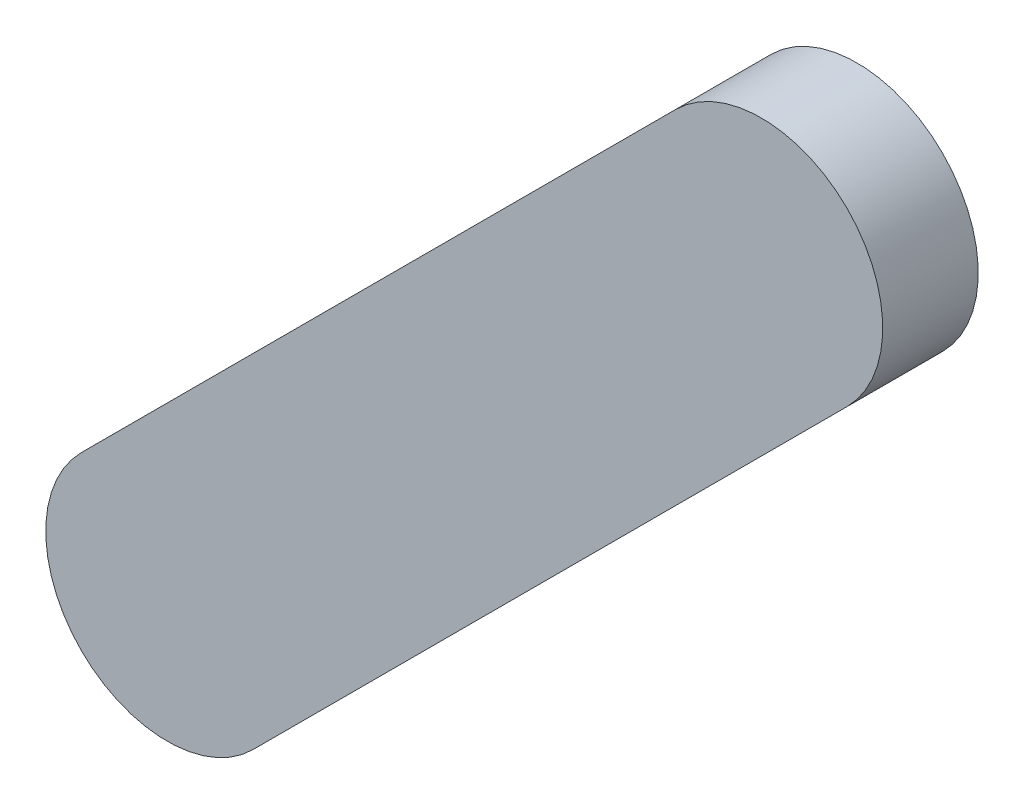
ISO-10303-21;
HEADER;
FILE_DESCRIPTION(('STEP AP214'),'2;1');
FILE_NAME('part.step','',(''),(''),'','','');
FILE_SCHEMA(('AUTOMOTIVE_DESIGN { 1 0 10303 214 1 1 1 1 }'));
ENDSEC;
DATA;
#1=APPLICATION_CONTEXT('core data for automotive mechanical design processes');
#2=APPLICATION_PROTOCOL_DEFINITION('international standard','automotive_design',2000,#1);
#3=PRODUCT_CONTEXT('',#1,'mechanical');
#4=PRODUCT('Part','Part','',(#3));
#5=PRODUCT_RELATED_PRODUCT_CATEGORY('part','',(#4));
#6=PRODUCT_DEFINITION_FORMATION('','',#4);
#7=PRODUCT_DEFINITION_CONTEXT('part definition',#1,'design');
#8=PRODUCT_DEFINITION('design','',#6,#7);
#9=PRODUCT_DEFINITION_SHAPE('','',#8);
#10=(LENGTH_UNIT() NAMED_UNIT(*) SI_UNIT(.MILLI.,.METRE.));
#11=(NAMED_UNIT(*) PLANE_ANGLE_UNIT() SI_UNIT($,.RADIAN.));
#12=(NAMED_UNIT(*) SI_UNIT($,.STERADIAN.) SOLID_ANGLE_UNIT());
#13=UNCERTAINTY_MEASURE_WITH_UNIT(LENGTH_MEASURE(1.E-05),#10,'distance_accuracy_value','');
#14=(GEOMETRIC_REPRESENTATION_CONTEXT(3) GLOBAL_UNCERTAINTY_ASSIGNED_CONTEXT((#13)) GLOBAL_UNIT_ASSIGNED_CONTEXT((#10,
#11,#12)) REPRESENTATION_CONTEXT('',''));
#15=CARTESIAN_POINT('',(0.,0.,0.));
#16=DIRECTION('',(0.,0.,1.));
#17=DIRECTION('',(1.,0.,0.));
#18=AXIS2_PLACEMENT_3D('',#15,#16,#17);
#19=CARTESIAN_POINT('',(113.66680594,53.5667966,0.));
#20=DIRECTION('',(-0.707106781186543,0.707106781186552,0.));
#21=DIRECTION('',(0.707106781186552,0.707106781186543,0.));
#22=AXIS2_PLACEMENT_3D('',#19,#20,#21);
#23=PLANE('',#22);
#24=DIRECTION('',(0.707106781186552,0.707106781186543,0.));
#25=VECTOR('',#24,1.);
#26=CARTESIAN_POINT('',(113.66680594,53.5667966,0.1999996));
#27=LINE('',#26,#25);
#28=CARTESIAN_POINT('',(113.66680594,53.5667966,0.1999996));
#29=VERTEX_POINT('',#28);
#30=CARTESIAN_POINT('',(114.9114034,54.81139406,0.1999996));
#31=VERTEX_POINT('',#30);
#32=EDGE_CURVE('E11',#29,#31,#27,.T.);
#33=ORIENTED_EDGE('',*,*,#32,.F.);
#34=DIRECTION('',(0.,0.,1.));
#35=VECTOR('',#34,1.);
#36=CARTESIAN_POINT('',(113.66680594,53.5667966,0.));
#37=LINE('',#36,#35);
#38=CARTESIAN_POINT('',(113.66680594,53.5667966,0.));
#39=VERTEX_POINT('',#38);
#40=EDGE_CURVE('E24',#39,#29,#37,.T.);
#41=ORIENTED_EDGE('',*,*,#40,.F.);
#42=DIRECTION('',(0.707106781186552,0.707106781186543,0.));
#43=VECTOR('',#42,1.);
#44=CARTESIAN_POINT('',(113.66680594,53.5667966,0.));
#45=LINE('',#44,#43);
#46=CARTESIAN_POINT('',(114.9114034,54.81139406,0.));
#47=VERTEX_POINT('',#46);
#48=EDGE_CURVE('E75',#39,#47,#45,.T.);
#49=ORIENTED_EDGE('',*,*,#48,.T.);
#50=DIRECTION('',(0.,0.,1.));
#51=VECTOR('',#50,1.);
#52=CARTESIAN_POINT('',(114.9114034,54.81139406,0.));
#53=LINE('',#52,#51);
#54=EDGE_CURVE('E37',#47,#31,#53,.T.);
#55=ORIENTED_EDGE('',*,*,#54,.T.);
#56=EDGE_LOOP('',(#33,#41,#49,#55));
#57=FACE_BOUND('',#56,.T.);
#58=ADVANCED_FACE('F17',(#57),#23,.F.);
#59=CARTESIAN_POINT('',(114.73179873,54.99099873,0.));
#60=DIRECTION('',(0.,0.,-1.));
#61=DIRECTION('',(0.707106781186548,-0.707106781186548,0.));
#62=AXIS2_PLACEMENT_3D('',#59,#60,#61);
#63=CYLINDRICAL_SURFACE('',#62,0.253999360179546);
#64=CARTESIAN_POINT('',(114.73179873,54.99099873,0.1999996));
#65=DIRECTION('',(0.,0.,1.));
#66=DIRECTION('',(0.707106781186548,-0.707106781186548,0.));
#67=AXIS2_PLACEMENT_3D('',#64,#65,#66);
#68=CIRCLE('',#67,0.253999360179546);
#69=CARTESIAN_POINT('',(114.55219406,55.1706034,0.1999996));
#70=VERTEX_POINT('',#69);
#71=EDGE_CURVE('E83',#31,#70,#68,.T.);
#72=ORIENTED_EDGE('',*,*,#71,.F.);
#73=ORIENTED_EDGE('',*,*,#54,.F.);
#74=CARTESIAN_POINT('',(114.73179873,54.99099873,0.));
#75=DIRECTION('',(0.,0.,1.));
#76=DIRECTION('',(0.707106781186548,-0.707106781186548,0.));
#77=AXIS2_PLACEMENT_3D('',#74,#75,#76);
#78=CIRCLE('',#77,0.253999360179546);
#79=CARTESIAN_POINT('',(114.55219406,55.1706034,0.));
#80=VERTEX_POINT('',#79);
#81=EDGE_CURVE('E81',#47,#80,#78,.T.);
#82=ORIENTED_EDGE('',*,*,#81,.T.);
#83=DIRECTION('',(0.,0.,1.));
#84=VECTOR('',#83,1.);
#85=CARTESIAN_POINT('',(114.55219406,55.1706034,0.));
#86=LINE('',#85,#84);
#87=EDGE_CURVE('E67',#80,#70,#86,.T.);
#88=ORIENTED_EDGE('',*,*,#87,.T.);
#89=EDGE_LOOP('',(#72,#73,#82,#88));
#90=FACE_BOUND('',#89,.T.);
#91=ADVANCED_FACE('F89',(#90),#63,.T.);
#92=CARTESIAN_POINT('',(114.55219406,55.1706034,0.));
#93=DIRECTION('',(0.707106781186548,-0.707106781186548,0.));
#94=DIRECTION('',(-0.707106781186548,-0.707106781186548,0.));
#95=AXIS2_PLACEMENT_3D('',#92,#93,#94);
#96=PLANE('',#95);
#97=DIRECTION('',(-0.707106781186548,-0.707106781186548,0.));
#98=VECTOR('',#97,1.);
#99=CARTESIAN_POINT('',(114.55219406,55.1706034,0.1999996));
#100=LINE('',#99,#98);
#101=CARTESIAN_POINT('',(113.3075966,53.92600594,0.1999996));
#102=VERTEX_POINT('',#101);
#103=EDGE_CURVE('E71',#70,#102,#100,.T.);
#104=ORIENTED_EDGE('',*,*,#103,.F.);
#105=ORIENTED_EDGE('',*,*,#87,.F.);
#106=DIRECTION('',(-0.707106781186548,-0.707106781186548,0.));
#107=VECTOR('',#106,1.);
#108=CARTESIAN_POINT('',(114.55219406,55.1706034,0.));
#109=LINE('',#108,#107);
#110=CARTESIAN_POINT('',(113.3075966,53.92600594,0.));
#111=VERTEX_POINT('',#110);
#112=EDGE_CURVE('E63',#80,#111,#109,.T.);
#113=ORIENTED_EDGE('',*,*,#112,.T.);
#114=DIRECTION('',(0.,0.,1.));
#115=VECTOR('',#114,1.);
#116=CARTESIAN_POINT('',(113.3075966,53.92600594,0.));
#117=LINE('',#116,#115);
#118=EDGE_CURVE('E53',#111,#102,#117,.T.);
#119=ORIENTED_EDGE('',*,*,#118,.T.);
#120=EDGE_LOOP('',(#104,#105,#113,#119));
#121=FACE_BOUND('',#120,.T.);
#122=ADVANCED_FACE('F66',(#121),#96,.F.);
#123=CARTESIAN_POINT('',(113.48720127,53.74640127,0.));
#124=DIRECTION('',(0.,0.,-1.));
#125=DIRECTION('',(-0.707106781186534,0.707106781186562,0.));
#126=AXIS2_PLACEMENT_3D('',#123,#124,#125);
#127=CYLINDRICAL_SURFACE('',#126,0.253999360179541);
#128=CARTESIAN_POINT('',(113.48720127,53.74640127,0.1999996));
#129=DIRECTION('',(0.,0.,1.));
#130=DIRECTION('',(-0.707106781186534,0.707106781186562,0.));
#131=AXIS2_PLACEMENT_3D('',#128,#129,#130);
#132=CIRCLE('',#131,0.253999360179541);
#133=EDGE_CURVE('E59',#102,#29,#132,.T.);
#134=ORIENTED_EDGE('',*,*,#133,.F.);
#135=ORIENTED_EDGE('',*,*,#118,.F.);
#136=CARTESIAN_POINT('',(113.48720127,53.74640127,0.));
#137=DIRECTION('',(0.,0.,1.));
#138=DIRECTION('',(-0.707106781186534,0.707106781186562,0.));
#139=AXIS2_PLACEMENT_3D('',#136,#137,#138);
#140=CIRCLE('',#139,0.253999360179541);
#141=EDGE_CURVE('E57',#111,#39,#140,.T.);
#142=ORIENTED_EDGE('',*,*,#141,.T.);
#143=ORIENTED_EDGE('',*,*,#40,.T.);
#144=EDGE_LOOP('',(#134,#135,#142,#143));
#145=FACE_BOUND('',#144,.T.);
#146=ADVANCED_FACE('F55',(#145),#127,.T.);
#147=CARTESIAN_POINT('',(113.66680594,53.5667966,0.));
#148=DIRECTION('',(0.,0.,-1.));
#149=DIRECTION('',(-1.,0.,0.));
#150=AXIS2_PLACEMENT_3D('',#147,#148,#149);
#151=PLANE('',#150);
#152=ORIENTED_EDGE('',*,*,#141,.F.);
#153=ORIENTED_EDGE('',*,*,#112,.F.);
#154=ORIENTED_EDGE('',*,*,#81,.F.);
#155=ORIENTED_EDGE('',*,*,#48,.F.);
#156=EDGE_LOOP('',(#152,#153,#154,#155));
#157=FACE_BOUND('',#156,.T.);
#158=ADVANCED_FACE('F74',(#157),#151,.T.);
#159=CARTESIAN_POINT('',(113.66680594,53.5667966,0.1999996));
#160=DIRECTION('',(0.,0.,-1.));
#161=DIRECTION('',(-1.,0.,0.));
#162=AXIS2_PLACEMENT_3D('',#159,#160,#161);
#163=PLANE('',#162);
#164=ORIENTED_EDGE('',*,*,#32,.T.);
#165=ORIENTED_EDGE('',*,*,#71,.T.);
#166=ORIENTED_EDGE('',*,*,#103,.T.);
#167=ORIENTED_EDGE('',*,*,#133,.T.);
#168=EDGE_LOOP('',(#164,#165,#166,#167));
#169=FACE_BOUND('',#168,.T.);
#170=ADVANCED_FACE('F91',(#169),#163,.F.);
#171=CLOSED_SHELL('',(#58,#91,#122,#146,#158,#170));
#172=MANIFOLD_SOLID_BREP('B1',#171);
#173=ADVANCED_BREP_SHAPE_REPRESENTATION('',(#18,#172),#14);
#174=SHAPE_DEFINITION_REPRESENTATION(#9,#173);
ENDSEC;
END-ISO-10303-21;
